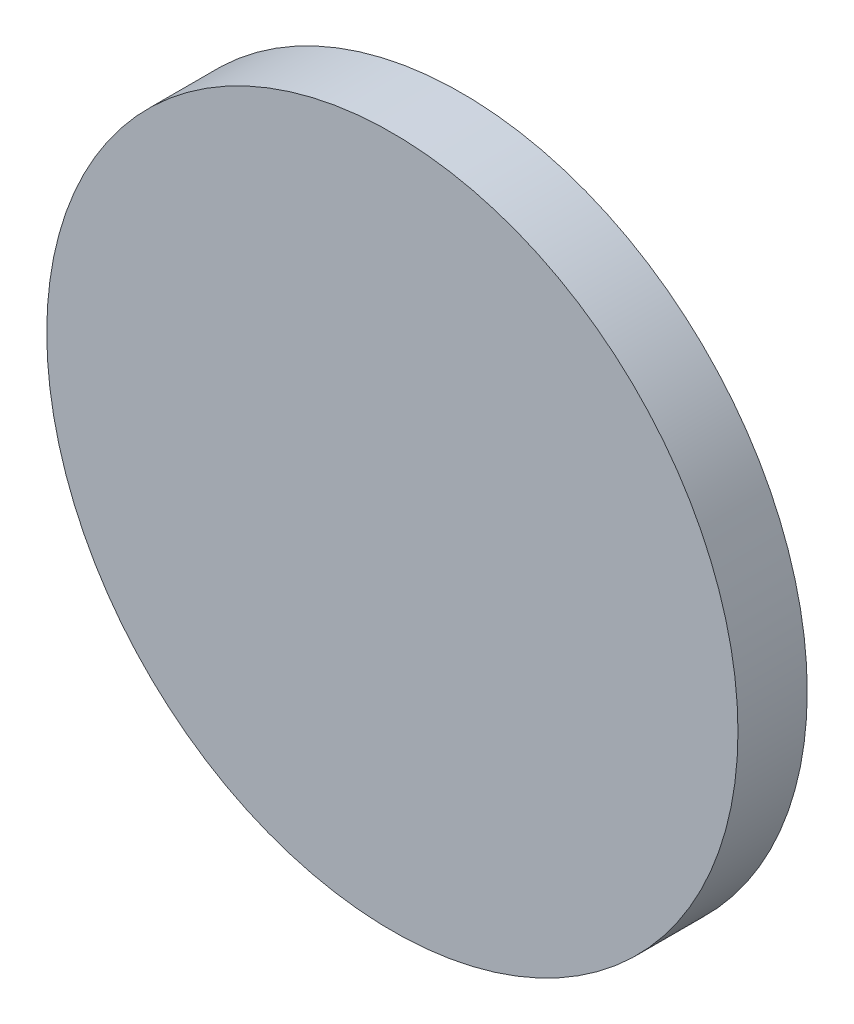
ISO-10303-21;
HEADER;
FILE_DESCRIPTION(('STEP AP214'),'2;1');
FILE_NAME('part.step','',(''),(''),'','','');
FILE_SCHEMA(('AUTOMOTIVE_DESIGN { 1 0 10303 214 1 1 1 1 }'));
ENDSEC;
DATA;
#1=APPLICATION_CONTEXT('core data for automotive mechanical design processes');
#2=APPLICATION_PROTOCOL_DEFINITION('international standard','automotive_design',2000,#1);
#3=PRODUCT_CONTEXT('',#1,'mechanical');
#4=PRODUCT('Part','Part','',(#3));
#5=PRODUCT_RELATED_PRODUCT_CATEGORY('part','',(#4));
#6=PRODUCT_DEFINITION_FORMATION('','',#4);
#7=PRODUCT_DEFINITION_CONTEXT('part definition',#1,'design');
#8=PRODUCT_DEFINITION('design','',#6,#7);
#9=PRODUCT_DEFINITION_SHAPE('','',#8);
#10=(LENGTH_UNIT() NAMED_UNIT(*) SI_UNIT(.MILLI.,.METRE.));
#11=(NAMED_UNIT(*) PLANE_ANGLE_UNIT() SI_UNIT($,.RADIAN.));
#12=(NAMED_UNIT(*) SI_UNIT($,.STERADIAN.) SOLID_ANGLE_UNIT());
#13=UNCERTAINTY_MEASURE_WITH_UNIT(LENGTH_MEASURE(1.E-05),#10,'distance_accuracy_value','');
#14=(GEOMETRIC_REPRESENTATION_CONTEXT(3) GLOBAL_UNCERTAINTY_ASSIGNED_CONTEXT((#13)) GLOBAL_UNIT_ASSIGNED_CONTEXT((#10,
#11,#12)) REPRESENTATION_CONTEXT('',''));
#15=CARTESIAN_POINT('',(0.,0.,0.));
#16=DIRECTION('',(0.,0.,1.));
#17=DIRECTION('',(1.,0.,0.));
#18=AXIS2_PLACEMENT_3D('',#15,#16,#17);
#19=CARTESIAN_POINT('',(0.,0.,2.33));
#20=DIRECTION('',(0.,0.,-1.));
#21=DIRECTION('',(-1.,0.,0.));
#22=AXIS2_PLACEMENT_3D('',#19,#20,#21);
#23=CYLINDRICAL_SURFACE('',#22,11.625);
#24=CARTESIAN_POINT('',(0.,0.,2.33));
#25=DIRECTION('',(0.,0.,1.));
#26=DIRECTION('',(1.,0.,0.));
#27=AXIS2_PLACEMENT_3D('',#24,#25,#26);
#28=CIRCLE('',#27,11.625);
#29=CARTESIAN_POINT('',(11.625,0.,2.33));
#30=VERTEX_POINT('',#29);
#31=EDGE_CURVE('E10',#30,#30,#28,.T.);
#32=ORIENTED_EDGE('',*,*,#31,.F.);
#33=EDGE_LOOP('',(#32));
#34=FACE_BOUND('',#33,.T.);
#35=CARTESIAN_POINT('',(0.,0.,0.));
#36=DIRECTION('',(0.,0.,1.));
#37=DIRECTION('',(1.,0.,0.));
#38=AXIS2_PLACEMENT_3D('',#35,#36,#37);
#39=CIRCLE('',#38,11.625);
#40=CARTESIAN_POINT('',(11.625,0.,0.));
#41=VERTEX_POINT('',#40);
#42=EDGE_CURVE('E34',#41,#41,#39,.T.);
#43=ORIENTED_EDGE('',*,*,#42,.T.);
#44=EDGE_LOOP('',(#43));
#45=FACE_BOUND('',#44,.T.);
#46=ADVANCED_FACE('F31',(#34,#45),#23,.T.);
#47=CARTESIAN_POINT('',(0.,0.,2.33));
#48=DIRECTION('',(0.,0.,1.));
#49=DIRECTION('',(1.,0.,0.));
#50=AXIS2_PLACEMENT_3D('',#47,#48,#49);
#51=PLANE('',#50);
#52=ORIENTED_EDGE('',*,*,#31,.T.);
#53=EDGE_LOOP('',(#52));
#54=FACE_BOUND('',#53,.T.);
#55=ADVANCED_FACE('F46',(#54),#51,.T.);
#56=CARTESIAN_POINT('',(0.,0.,0.));
#57=DIRECTION('',(0.,0.,1.));
#58=DIRECTION('',(1.,0.,0.));
#59=AXIS2_PLACEMENT_3D('',#56,#57,#58);
#60=PLANE('',#59);
#61=ORIENTED_EDGE('',*,*,#42,.F.);
#62=EDGE_LOOP('',(#61));
#63=FACE_BOUND('',#62,.T.);
#64=ADVANCED_FACE('F44',(#63),#60,.F.);
#65=CLOSED_SHELL('',(#46,#55,#64));
#66=MANIFOLD_SOLID_BREP('B2',#65);
#67=ADVANCED_BREP_SHAPE_REPRESENTATION('',(#18,#66),#14);
#68=SHAPE_DEFINITION_REPRESENTATION(#9,#67);
ENDSEC;
END-ISO-10303-21;
